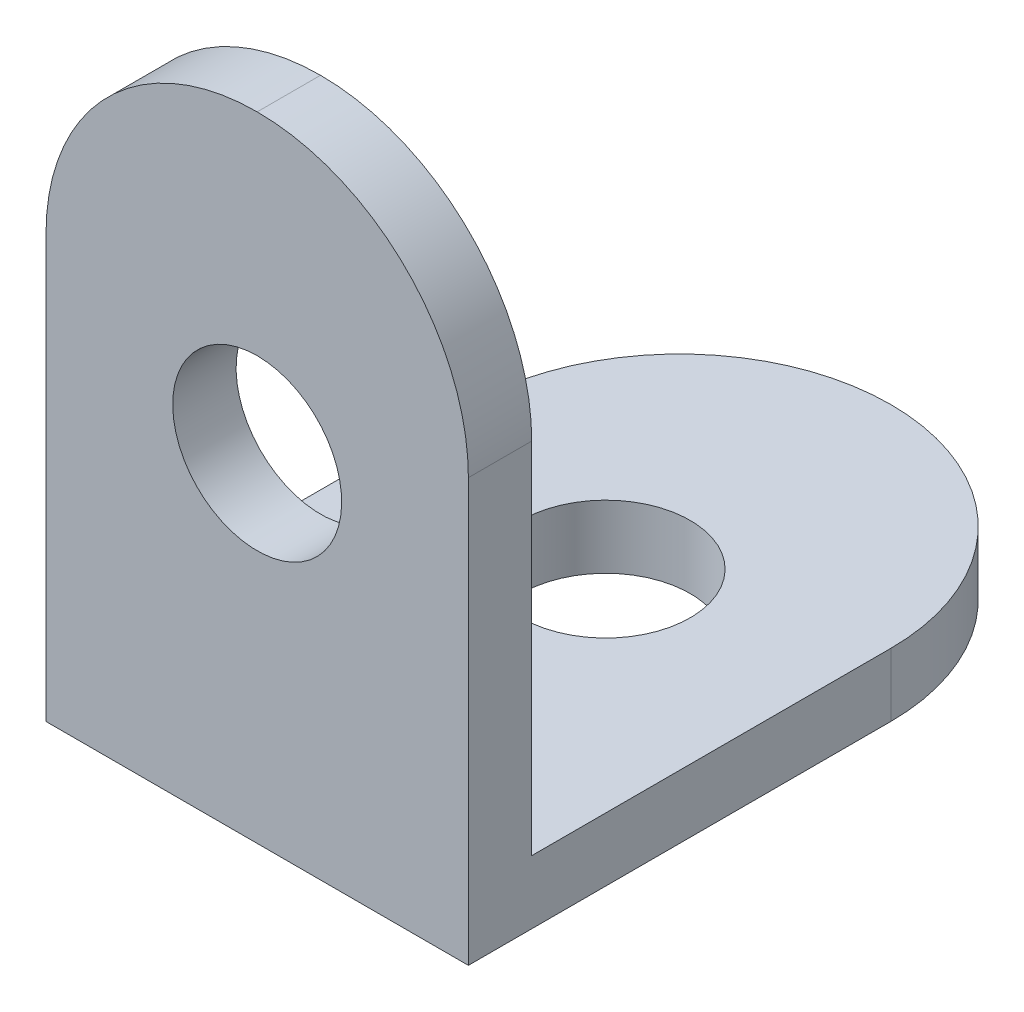
ISO-10303-21;
HEADER;
FILE_DESCRIPTION(('STEP AP214'),'2;1');
FILE_NAME('part.step','',(''),(''),'','','');
FILE_SCHEMA(('AUTOMOTIVE_DESIGN { 1 0 10303 214 1 1 1 1 }'));
ENDSEC;
DATA;
#1=APPLICATION_CONTEXT('core data for automotive mechanical design processes');
#2=APPLICATION_PROTOCOL_DEFINITION('international standard','automotive_design',2000,#1);
#3=PRODUCT_CONTEXT('',#1,'mechanical');
#4=PRODUCT('Part','Part','',(#3));
#5=PRODUCT_RELATED_PRODUCT_CATEGORY('part','',(#4));
#6=PRODUCT_DEFINITION_FORMATION('','',#4);
#7=PRODUCT_DEFINITION_CONTEXT('part definition',#1,'design');
#8=PRODUCT_DEFINITION('design','',#6,#7);
#9=PRODUCT_DEFINITION_SHAPE('','',#8);
#10=(LENGTH_UNIT() NAMED_UNIT(*) SI_UNIT(.MILLI.,.METRE.));
#11=(NAMED_UNIT(*) PLANE_ANGLE_UNIT() SI_UNIT($,.RADIAN.));
#12=(NAMED_UNIT(*) SI_UNIT($,.STERADIAN.) SOLID_ANGLE_UNIT());
#13=UNCERTAINTY_MEASURE_WITH_UNIT(LENGTH_MEASURE(1.E-05),#10,'distance_accuracy_value','');
#14=(GEOMETRIC_REPRESENTATION_CONTEXT(3) GLOBAL_UNCERTAINTY_ASSIGNED_CONTEXT((#13)) GLOBAL_UNIT_ASSIGNED_CONTEXT((#10,
#11,#12)) REPRESENTATION_CONTEXT('',''));
#15=CARTESIAN_POINT('',(0.,0.,0.));
#16=DIRECTION('',(0.,0.,1.));
#17=DIRECTION('',(1.,0.,0.));
#18=AXIS2_PLACEMENT_3D('',#15,#16,#17);
#19=CARTESIAN_POINT('',(10.,0.,-6.75));
#20=DIRECTION('',(0.,-1.,0.));
#21=DIRECTION('',(0.,0.,-1.));
#22=AXIS2_PLACEMENT_3D('',#19,#20,#21);
#23=PLANE('',#22);
#24=CARTESIAN_POINT('',(5.,0.,0.));
#25=DIRECTION('',(0.,1.,0.));
#26=DIRECTION('',(0.,0.,1.));
#27=AXIS2_PLACEMENT_3D('',#24,#25,#26);
#28=CIRCLE('',#27,2.);
#29=CARTESIAN_POINT('',(5.,0.,2.));
#30=VERTEX_POINT('',#29);
#31=EDGE_CURVE('E202',#30,#30,#28,.T.);
#32=ORIENTED_EDGE('',*,*,#31,.F.);
#33=EDGE_LOOP('',(#32));
#34=FACE_BOUND('',#33,.T.);
#35=DIRECTION('',(0.,0.,1.));
#36=VECTOR('',#35,1.);
#37=CARTESIAN_POINT('',(10.,0.,-6.75));
#38=LINE('',#37,#36);
#39=CARTESIAN_POINT('',(10.,0.,-1.75));
#40=VERTEX_POINT('',#39);
#41=CARTESIAN_POINT('',(10.,0.,6.75));
#42=VERTEX_POINT('',#41);
#43=EDGE_CURVE('E107',#40,#42,#38,.T.);
#44=ORIENTED_EDGE('',*,*,#43,.F.);
#45=CARTESIAN_POINT('',(5.,0.,-1.75));
#46=DIRECTION('',(0.,-1.,0.));
#47=DIRECTION('',(0.,0.,-1.));
#48=AXIS2_PLACEMENT_3D('',#45,#46,#47);
#49=CIRCLE('',#48,5.);
#50=CARTESIAN_POINT('',(5.,0.,-6.75));
#51=VERTEX_POINT('',#50);
#52=EDGE_CURVE('E185',#40,#51,#49,.F.);
#53=ORIENTED_EDGE('',*,*,#52,.T.);
#54=CARTESIAN_POINT('',(5.,0.,-1.75));
#55=DIRECTION('',(0.,-1.,0.));
#56=DIRECTION('',(0.,0.,-1.));
#57=AXIS2_PLACEMENT_3D('',#54,#55,#56);
#58=CIRCLE('',#57,5.);
#59=CARTESIAN_POINT('',(0.,0.,-1.75));
#60=VERTEX_POINT('',#59);
#61=EDGE_CURVE('E182',#51,#60,#58,.F.);
#62=ORIENTED_EDGE('',*,*,#61,.T.);
#63=DIRECTION('',(0.,0.,1.));
#64=VECTOR('',#63,1.);
#65=CARTESIAN_POINT('',(0.,0.,-6.75));
#66=LINE('',#65,#64);
#67=CARTESIAN_POINT('',(0.,0.,6.75));
#68=VERTEX_POINT('',#67);
#69=EDGE_CURVE('E122',#60,#68,#66,.T.);
#70=ORIENTED_EDGE('',*,*,#69,.T.);
#71=DIRECTION('',(-1.,0.,0.));
#72=VECTOR('',#71,1.);
#73=CARTESIAN_POINT('',(10.,0.,6.75));
#74=LINE('',#73,#72);
#75=EDGE_CURVE('E121',#42,#68,#74,.T.);
#76=ORIENTED_EDGE('',*,*,#75,.F.);
#77=EDGE_LOOP('',(#44,#53,#62,#70,#76));
#78=FACE_BOUND('',#77,.T.);
#79=ADVANCED_FACE('F39',(#34,#78),#23,.F.);
#80=CARTESIAN_POINT('',(10.,0.,6.75));
#81=DIRECTION('',(0.,0.,1.));
#82=DIRECTION('',(0.,-1.,0.));
#83=AXIS2_PLACEMENT_3D('',#80,#81,#82);
#84=PLANE('',#83);
#85=CARTESIAN_POINT('',(5.,6.5,6.75));
#86=DIRECTION('',(0.,0.,-1.));
#87=DIRECTION('',(0.,1.,0.));
#88=AXIS2_PLACEMENT_3D('',#85,#86,#87);
#89=CIRCLE('',#88,2.);
#90=CARTESIAN_POINT('',(5.,8.5,6.75));
#91=VERTEX_POINT('',#90);
#92=EDGE_CURVE('E178',#91,#91,#89,.T.);
#93=ORIENTED_EDGE('',*,*,#92,.F.);
#94=EDGE_LOOP('',(#93));
#95=FACE_BOUND('',#94,.T.);
#96=DIRECTION('',(0.,1.,0.));
#97=VECTOR('',#96,1.);
#98=CARTESIAN_POINT('',(0.,0.,6.75));
#99=LINE('',#98,#97);
#100=CARTESIAN_POINT('',(0.,8.49999999999999,6.75));
#101=VERTEX_POINT('',#100);
#102=EDGE_CURVE('E145',#68,#101,#99,.T.);
#103=ORIENTED_EDGE('',*,*,#102,.T.);
#104=CARTESIAN_POINT('',(5.,8.49999999999999,6.75));
#105=DIRECTION('',(0.,0.,1.));
#106=DIRECTION('',(0.,-1.,0.));
#107=AXIS2_PLACEMENT_3D('',#104,#105,#106);
#108=CIRCLE('',#107,5.);
#109=CARTESIAN_POINT('',(5.,13.5,6.75));
#110=VERTEX_POINT('',#109);
#111=EDGE_CURVE('E168',#101,#110,#108,.F.);
#112=ORIENTED_EDGE('',*,*,#111,.T.);
#113=CARTESIAN_POINT('',(5.,8.49999999999999,6.75));
#114=DIRECTION('',(0.,0.,1.));
#115=DIRECTION('',(0.,-1.,0.));
#116=AXIS2_PLACEMENT_3D('',#113,#114,#115);
#117=CIRCLE('',#116,5.);
#118=CARTESIAN_POINT('',(10.,8.49999999999999,6.75));
#119=VERTEX_POINT('',#118);
#120=EDGE_CURVE('E132',#110,#119,#117,.F.);
#121=ORIENTED_EDGE('',*,*,#120,.T.);
#122=DIRECTION('',(0.,1.,0.));
#123=VECTOR('',#122,1.);
#124=CARTESIAN_POINT('',(10.,0.,6.75));
#125=LINE('',#124,#123);
#126=EDGE_CURVE('E112',#42,#119,#125,.T.);
#127=ORIENTED_EDGE('',*,*,#126,.F.);
#128=ORIENTED_EDGE('',*,*,#75,.T.);
#129=EDGE_LOOP('',(#103,#112,#121,#127,#128));
#130=FACE_BOUND('',#129,.T.);
#131=ADVANCED_FACE('F130',(#95,#130),#84,.F.);
#132=CARTESIAN_POINT('',(10.,13.5,8.25));
#133=DIRECTION('',(0.,0.,-1.));
#134=DIRECTION('',(0.,1.,0.));
#135=AXIS2_PLACEMENT_3D('',#132,#133,#134);
#136=PLANE('',#135);
#137=CARTESIAN_POINT('',(5.,6.5,8.25000000000001));
#138=DIRECTION('',(0.,0.,-1.));
#139=DIRECTION('',(0.,1.,0.));
#140=AXIS2_PLACEMENT_3D('',#137,#138,#139);
#141=CIRCLE('',#140,2.);
#142=CARTESIAN_POINT('',(5.,8.5,8.25000000000001));
#143=VERTEX_POINT('',#142);
#144=EDGE_CURVE('E146',#143,#143,#141,.T.);
#145=ORIENTED_EDGE('',*,*,#144,.T.);
#146=EDGE_LOOP('',(#145));
#147=FACE_BOUND('',#146,.T.);
#148=CARTESIAN_POINT('',(5.,8.49999999999999,8.25));
#149=DIRECTION('',(0.,0.,-1.));
#150=DIRECTION('',(0.,1.,0.));
#151=AXIS2_PLACEMENT_3D('',#148,#149,#150);
#152=CIRCLE('',#151,5.);
#153=CARTESIAN_POINT('',(10.,8.49999999999999,8.25));
#154=VERTEX_POINT('',#153);
#155=CARTESIAN_POINT('',(5.,13.5,8.25));
#156=VERTEX_POINT('',#155);
#157=EDGE_CURVE('E127',#154,#156,#152,.F.);
#158=ORIENTED_EDGE('',*,*,#157,.T.);
#159=CARTESIAN_POINT('',(5.,8.49999999999999,8.25));
#160=DIRECTION('',(0.,0.,-1.));
#161=DIRECTION('',(0.,1.,0.));
#162=AXIS2_PLACEMENT_3D('',#159,#160,#161);
#163=CIRCLE('',#162,5.);
#164=CARTESIAN_POINT('',(0.,8.49999999999999,8.25));
#165=VERTEX_POINT('',#164);
#166=EDGE_CURVE('E159',#156,#165,#163,.F.);
#167=ORIENTED_EDGE('',*,*,#166,.T.);
#168=DIRECTION('',(0.,-1.,0.));
#169=VECTOR('',#168,1.);
#170=CARTESIAN_POINT('',(0.,13.5,8.25));
#171=LINE('',#170,#169);
#172=CARTESIAN_POINT('',(0.,-1.5,8.25));
#173=VERTEX_POINT('',#172);
#174=EDGE_CURVE('E149',#165,#173,#171,.T.);
#175=ORIENTED_EDGE('',*,*,#174,.T.);
#176=DIRECTION('',(-1.,0.,0.));
#177=VECTOR('',#176,1.);
#178=CARTESIAN_POINT('',(10.,-1.5,8.25));
#179=LINE('',#178,#177);
#180=CARTESIAN_POINT('',(10.,-1.5,8.25));
#181=VERTEX_POINT('',#180);
#182=EDGE_CURVE('E128',#181,#173,#179,.T.);
#183=ORIENTED_EDGE('',*,*,#182,.F.);
#184=DIRECTION('',(0.,-1.,0.));
#185=VECTOR('',#184,1.);
#186=CARTESIAN_POINT('',(10.,13.5,8.25));
#187=LINE('',#186,#185);
#188=EDGE_CURVE('E134',#154,#181,#187,.T.);
#189=ORIENTED_EDGE('',*,*,#188,.F.);
#190=EDGE_LOOP('',(#158,#167,#175,#183,#189));
#191=FACE_BOUND('',#190,.T.);
#192=ADVANCED_FACE('F221',(#147,#191),#136,.F.);
#193=CARTESIAN_POINT('',(10.,-1.5,8.25));
#194=DIRECTION('',(0.,1.,0.));
#195=DIRECTION('',(0.,0.,1.));
#196=AXIS2_PLACEMENT_3D('',#193,#194,#195);
#197=PLANE('',#196);
#198=CARTESIAN_POINT('',(5.,-1.5,0.));
#199=DIRECTION('',(0.,1.,0.));
#200=DIRECTION('',(0.,0.,1.));
#201=AXIS2_PLACEMENT_3D('',#198,#199,#200);
#202=CIRCLE('',#201,2.);
#203=CARTESIAN_POINT('',(5.,-1.5,2.));
#204=VERTEX_POINT('',#203);
#205=EDGE_CURVE('E179',#204,#204,#202,.T.);
#206=ORIENTED_EDGE('',*,*,#205,.T.);
#207=EDGE_LOOP('',(#206));
#208=FACE_BOUND('',#207,.T.);
#209=CARTESIAN_POINT('',(5.,-1.5,-1.75));
#210=DIRECTION('',(0.,1.,0.));
#211=DIRECTION('',(0.,0.,1.));
#212=AXIS2_PLACEMENT_3D('',#209,#210,#211);
#213=CIRCLE('',#212,5.);
#214=CARTESIAN_POINT('',(0.,-1.5,-1.75));
#215=VERTEX_POINT('',#214);
#216=CARTESIAN_POINT('',(5.,-1.5,-6.75));
#217=VERTEX_POINT('',#216);
#218=EDGE_CURVE('E56',#215,#217,#213,.F.);
#219=ORIENTED_EDGE('',*,*,#218,.T.);
#220=CARTESIAN_POINT('',(5.,-1.5,-1.75));
#221=DIRECTION('',(0.,1.,0.));
#222=DIRECTION('',(0.,0.,1.));
#223=AXIS2_PLACEMENT_3D('',#220,#221,#222);
#224=CIRCLE('',#223,5.);
#225=CARTESIAN_POINT('',(10.,-1.5,-1.75));
#226=VERTEX_POINT('',#225);
#227=EDGE_CURVE('E49',#217,#226,#224,.F.);
#228=ORIENTED_EDGE('',*,*,#227,.T.);
#229=DIRECTION('',(0.,0.,-1.));
#230=VECTOR('',#229,1.);
#231=CARTESIAN_POINT('',(10.,-1.5,8.25));
#232=LINE('',#231,#230);
#233=EDGE_CURVE('E137',#181,#226,#232,.T.);
#234=ORIENTED_EDGE('',*,*,#233,.F.);
#235=ORIENTED_EDGE('',*,*,#182,.T.);
#236=DIRECTION('',(0.,0.,-1.));
#237=VECTOR('',#236,1.);
#238=CARTESIAN_POINT('',(0.,-1.5,8.25));
#239=LINE('',#238,#237);
#240=EDGE_CURVE('E118',#173,#215,#239,.T.);
#241=ORIENTED_EDGE('',*,*,#240,.T.);
#242=EDGE_LOOP('',(#219,#228,#234,#235,#241));
#243=FACE_BOUND('',#242,.T.);
#244=ADVANCED_FACE('F193',(#208,#243),#197,.F.);
#245=CARTESIAN_POINT('',(10.,0.,0.));
#246=DIRECTION('',(1.,0.,0.));
#247=DIRECTION('',(0.,0.,-1.));
#248=AXIS2_PLACEMENT_3D('',#245,#246,#247);
#249=PLANE('',#248);
#250=ORIENTED_EDGE('',*,*,#233,.T.);
#251=DIRECTION('',(0.,1.,0.));
#252=VECTOR('',#251,1.);
#253=CARTESIAN_POINT('',(10.,0.,-1.75));
#254=LINE('',#253,#252);
#255=EDGE_CURVE('E115',#226,#40,#254,.T.);
#256=ORIENTED_EDGE('',*,*,#255,.T.);
#257=ORIENTED_EDGE('',*,*,#43,.T.);
#258=ORIENTED_EDGE('',*,*,#126,.T.);
#259=DIRECTION('',(0.,0.,1.));
#260=VECTOR('',#259,1.);
#261=CARTESIAN_POINT('',(10.,8.49999999999999,8.25));
#262=LINE('',#261,#260);
#263=EDGE_CURVE('E171',#119,#154,#262,.T.);
#264=ORIENTED_EDGE('',*,*,#263,.T.);
#265=ORIENTED_EDGE('',*,*,#188,.T.);
#266=EDGE_LOOP('',(#250,#256,#257,#258,#264,#265));
#267=FACE_BOUND('',#266,.T.);
#268=ADVANCED_FACE('F110',(#267),#249,.T.);
#269=CARTESIAN_POINT('',(0.,0.,0.));
#270=DIRECTION('',(1.,0.,0.));
#271=DIRECTION('',(0.,0.,-1.));
#272=AXIS2_PLACEMENT_3D('',#269,#270,#271);
#273=PLANE('',#272);
#274=ORIENTED_EDGE('',*,*,#69,.F.);
#275=DIRECTION('',(0.,1.,0.));
#276=VECTOR('',#275,1.);
#277=CARTESIAN_POINT('',(0.,0.,-1.75));
#278=LINE('',#277,#276);
#279=EDGE_CURVE('E11',#60,#215,#278,.F.);
#280=ORIENTED_EDGE('',*,*,#279,.T.);
#281=ORIENTED_EDGE('',*,*,#240,.F.);
#282=ORIENTED_EDGE('',*,*,#174,.F.);
#283=DIRECTION('',(0.,0.,1.));
#284=VECTOR('',#283,1.);
#285=CARTESIAN_POINT('',(0.,8.49999999999999,0.));
#286=LINE('',#285,#284);
#287=EDGE_CURVE('E162',#165,#101,#286,.F.);
#288=ORIENTED_EDGE('',*,*,#287,.T.);
#289=ORIENTED_EDGE('',*,*,#102,.F.);
#290=EDGE_LOOP('',(#274,#280,#281,#282,#288,#289));
#291=FACE_BOUND('',#290,.T.);
#292=ADVANCED_FACE('F256',(#291),#273,.F.);
#293=CARTESIAN_POINT('',(5.,6.5,8.25000000000001));
#294=DIRECTION('',(0.,0.,-1.));
#295=DIRECTION('',(0.,1.,0.));
#296=AXIS2_PLACEMENT_3D('',#293,#294,#295);
#297=CYLINDRICAL_SURFACE('',#296,2.);
#298=ORIENTED_EDGE('',*,*,#144,.F.);
#299=EDGE_LOOP('',(#298));
#300=FACE_BOUND('',#299,.T.);
#301=ORIENTED_EDGE('',*,*,#92,.T.);
#302=EDGE_LOOP('',(#301));
#303=FACE_BOUND('',#302,.T.);
#304=ADVANCED_FACE('F218',(#300,#303),#297,.F.);
#305=CARTESIAN_POINT('',(5.,8.49999999999999,0.));
#306=DIRECTION('',(0.,0.,-1.));
#307=DIRECTION('',(-1.,0.,0.));
#308=AXIS2_PLACEMENT_3D('',#305,#306,#307);
#309=CYLINDRICAL_SURFACE('',#308,5.);
#310=ORIENTED_EDGE('',*,*,#263,.F.);
#311=ORIENTED_EDGE('',*,*,#120,.F.);
#312=DIRECTION('',(0.,0.,1.));
#313=VECTOR('',#312,1.);
#314=CARTESIAN_POINT('',(5.,13.5,6.75));
#315=LINE('',#314,#313);
#316=EDGE_CURVE('E174',#156,#110,#315,.F.);
#317=ORIENTED_EDGE('',*,*,#316,.F.);
#318=ORIENTED_EDGE('',*,*,#157,.F.);
#319=EDGE_LOOP('',(#310,#311,#317,#318));
#320=FACE_BOUND('',#319,.T.);
#321=ADVANCED_FACE('F237',(#320),#309,.T.);
#322=CARTESIAN_POINT('',(5.,8.49999999999999,6.75));
#323=DIRECTION('',(0.,0.,1.));
#324=DIRECTION('',(1.,0.,0.));
#325=AXIS2_PLACEMENT_3D('',#322,#323,#324);
#326=CYLINDRICAL_SURFACE('',#325,5.);
#327=ORIENTED_EDGE('',*,*,#111,.F.);
#328=ORIENTED_EDGE('',*,*,#287,.F.);
#329=ORIENTED_EDGE('',*,*,#166,.F.);
#330=ORIENTED_EDGE('',*,*,#316,.T.);
#331=EDGE_LOOP('',(#327,#328,#329,#330));
#332=FACE_BOUND('',#331,.T.);
#333=ADVANCED_FACE('F233',(#332),#326,.T.);
#334=CARTESIAN_POINT('',(5.,-1.5,0.));
#335=DIRECTION('',(0.,1.,0.));
#336=DIRECTION('',(0.,0.,1.));
#337=AXIS2_PLACEMENT_3D('',#334,#335,#336);
#338=CYLINDRICAL_SURFACE('',#337,2.);
#339=CARTESIAN_POINT('',(5.,-1.5,2.));
#340=CARTESIAN_POINT('',(5.,-1.484375,2.));
#341=CARTESIAN_POINT('',(5.,-1.46875,2.));
#342=CARTESIAN_POINT('',(5.,-1.4375,2.));
#343=CARTESIAN_POINT('',(5.,-1.421875,2.));
#344=CARTESIAN_POINT('',(5.,-1.390625,2.));
#345=CARTESIAN_POINT('',(5.,-1.375,2.));
#346=CARTESIAN_POINT('',(5.,-1.34375,2.));
#347=CARTESIAN_POINT('',(5.,-1.328125,2.));
#348=CARTESIAN_POINT('',(5.,-1.296875,2.));
#349=CARTESIAN_POINT('',(5.,-1.28125,2.));
#350=CARTESIAN_POINT('',(5.,-1.25,2.));
#351=CARTESIAN_POINT('',(5.,-1.234375,2.));
#352=CARTESIAN_POINT('',(5.,-1.203125,2.));
#353=CARTESIAN_POINT('',(5.,-1.1875,2.));
#354=CARTESIAN_POINT('',(5.,-1.15625,2.));
#355=CARTESIAN_POINT('',(5.,-1.140625,2.));
#356=CARTESIAN_POINT('',(5.,-1.109375,2.));
#357=CARTESIAN_POINT('',(5.,-1.09375,2.));
#358=CARTESIAN_POINT('',(5.,-1.0625,2.));
#359=CARTESIAN_POINT('',(5.,-1.046875,2.));
#360=CARTESIAN_POINT('',(5.,-1.015625,2.));
#361=CARTESIAN_POINT('',(5.,-1.,2.));
#362=CARTESIAN_POINT('',(5.,-0.96875,2.));
#363=CARTESIAN_POINT('',(5.,-0.953125,2.));
#364=CARTESIAN_POINT('',(5.,-0.921875,2.));
#365=CARTESIAN_POINT('',(5.,-0.90625,2.));
#366=CARTESIAN_POINT('',(5.,-0.875,2.));
#367=CARTESIAN_POINT('',(5.,-0.859375,2.));
#368=CARTESIAN_POINT('',(5.,-0.828125,2.));
#369=CARTESIAN_POINT('',(5.,-0.8125,2.));
#370=CARTESIAN_POINT('',(5.,-0.78125,2.));
#371=CARTESIAN_POINT('',(5.,-0.765625,2.));
#372=CARTESIAN_POINT('',(5.,-0.734375,2.));
#373=CARTESIAN_POINT('',(5.,-0.71875,2.));
#374=CARTESIAN_POINT('',(5.,-0.6875,2.));
#375=CARTESIAN_POINT('',(5.,-0.671875,2.));
#376=CARTESIAN_POINT('',(5.,-0.640625,2.));
#377=CARTESIAN_POINT('',(5.,-0.625,2.));
#378=CARTESIAN_POINT('',(5.,-0.59375,2.));
#379=CARTESIAN_POINT('',(5.,-0.578125,2.));
#380=CARTESIAN_POINT('',(5.,-0.546875,2.));
#381=CARTESIAN_POINT('',(5.,-0.53125,2.));
#382=CARTESIAN_POINT('',(5.,-0.5,2.));
#383=CARTESIAN_POINT('',(5.,-0.484375,2.));
#384=CARTESIAN_POINT('',(5.,-0.453125,2.));
#385=CARTESIAN_POINT('',(5.,-0.4375,2.));
#386=CARTESIAN_POINT('',(5.,-0.40625,2.));
#387=CARTESIAN_POINT('',(5.,-0.390625,2.));
#388=CARTESIAN_POINT('',(5.,-0.359375,2.));
#389=CARTESIAN_POINT('',(5.,-0.34375,2.));
#390=CARTESIAN_POINT('',(5.,-0.3125,2.));
#391=CARTESIAN_POINT('',(5.,-0.296875,2.));
#392=CARTESIAN_POINT('',(5.,-0.265625,2.));
#393=CARTESIAN_POINT('',(5.,-0.25,2.));
#394=CARTESIAN_POINT('',(5.,-0.21875,2.));
#395=CARTESIAN_POINT('',(5.,-0.203125,2.));
#396=CARTESIAN_POINT('',(5.,-0.171875,2.));
#397=CARTESIAN_POINT('',(5.,-0.15625,2.));
#398=CARTESIAN_POINT('',(5.,-0.125,2.));
#399=CARTESIAN_POINT('',(5.,-0.109375,2.));
#400=CARTESIAN_POINT('',(5.,-0.0781250000000001,2.));
#401=CARTESIAN_POINT('',(5.,-0.0625000000000001,2.));
#402=CARTESIAN_POINT('',(5.,-0.03125,2.));
#403=CARTESIAN_POINT('',(5.,-0.015625,2.));
#404=CARTESIAN_POINT('',(5.,0.,2.));
#405=B_SPLINE_CURVE_WITH_KNOTS('',3,(#339,#340,#341,#342,#343,#344,#345,#346,#347,#348,#349,
#350,#351,#352,#353,#354,#355,#356,#357,#358,#359,#360,#361,#362,#363,#364,#365,#366,#367,#368,
#369,#370,#371,#372,#373,#374,#375,#376,#377,#378,#379,#380,#381,#382,#383,#384,#385,#386,#387,
#388,#389,#390,#391,#392,#393,#394,#395,#396,#397,#398,#399,#400,#401,#402,#403,#404),
.UNSPECIFIED.,.F.,.F.,(4,2,2,2,2,2,2,2,2,2,2,2,2,2,2,2,2,2,2,2,2,2,2,2,2,2,2,2,2,2,2,2,4),(0.,
0.046875,0.0937500000000001,0.140625,0.1875,0.234375,0.28125,0.328125,0.375,0.421875,0.46875,
0.515625,0.5625,0.609375,0.65625,0.703125,0.75,0.796875,0.84375,0.890625,0.9375,0.984375,
1.03125,1.078125,1.125,1.171875,1.21875,1.265625,1.3125,1.359375,1.40625,1.453125,1.5),.UNSPECIFIED.);
#406=EDGE_CURVE('BSEAM236',#204,#30,#405,.T.);
#407=ORIENTED_EDGE('',*,*,#205,.F.);
#408=ORIENTED_EDGE('',*,*,#31,.T.);
#409=ORIENTED_EDGE('',*,*,#406,.T.);
#410=ORIENTED_EDGE('',*,*,#406,.F.);
#411=EDGE_LOOP('',(#407,#409,#408,#410));
#412=FACE_BOUND('',#411,.T.);
#413=ADVANCED_FACE('F236',(#412),#338,.F.);
#414=CARTESIAN_POINT('',(5.,-1.5,-1.75));
#415=DIRECTION('',(0.,1.,0.));
#416=DIRECTION('',(0.,0.,1.));
#417=AXIS2_PLACEMENT_3D('',#414,#415,#416);
#418=CYLINDRICAL_SURFACE('',#417,5.);
#419=DIRECTION('',(0.,1.,0.));
#420=VECTOR('',#419,1.);
#421=CARTESIAN_POINT('',(5.,-1.5,-6.75));
#422=LINE('',#421,#420);
#423=EDGE_CURVE('E43',#217,#51,#422,.T.);
#424=ORIENTED_EDGE('',*,*,#423,.F.);
#425=ORIENTED_EDGE('',*,*,#218,.F.);
#426=ORIENTED_EDGE('',*,*,#279,.F.);
#427=ORIENTED_EDGE('',*,*,#61,.F.);
#428=EDGE_LOOP('',(#424,#425,#426,#427));
#429=FACE_BOUND('',#428,.T.);
#430=ADVANCED_FACE('F41',(#429),#418,.T.);
#431=CARTESIAN_POINT('',(5.,0.,-1.75));
#432=DIRECTION('',(0.,-1.,0.));
#433=DIRECTION('',(0.,0.,-1.));
#434=AXIS2_PLACEMENT_3D('',#431,#432,#433);
#435=CYLINDRICAL_SURFACE('',#434,5.);
#436=ORIENTED_EDGE('',*,*,#227,.F.);
#437=ORIENTED_EDGE('',*,*,#423,.T.);
#438=ORIENTED_EDGE('',*,*,#52,.F.);
#439=ORIENTED_EDGE('',*,*,#255,.F.);
#440=EDGE_LOOP('',(#436,#437,#438,#439));
#441=FACE_BOUND('',#440,.T.);
#442=ADVANCED_FACE('F198',(#441),#435,.T.);
#443=CLOSED_SHELL('',(#79,#131,#192,#244,#268,#292,#304,#321,#333,#413,#430,#442));
#444=MANIFOLD_SOLID_BREP('B2',#443);
#445=ADVANCED_BREP_SHAPE_REPRESENTATION('',(#18,#444),#14);
#446=SHAPE_DEFINITION_REPRESENTATION(#9,#445);
ENDSEC;
END-ISO-10303-21;
